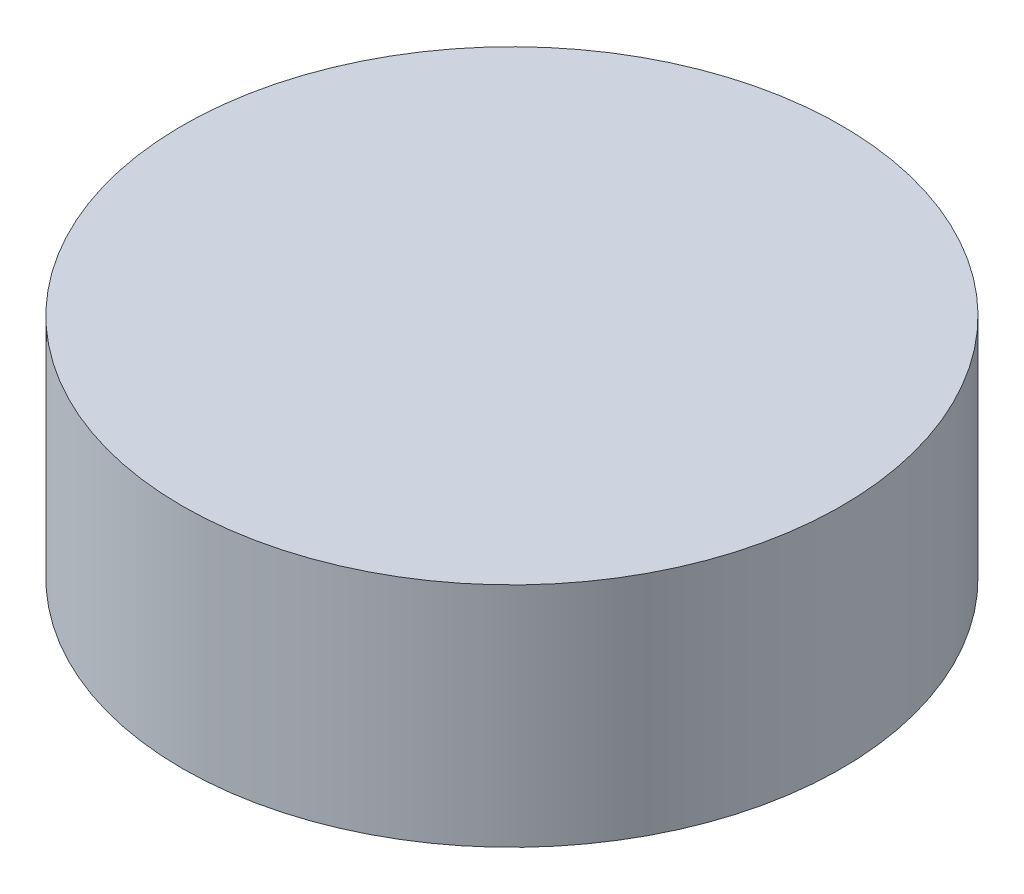
ISO-10303-21;
HEADER;
FILE_DESCRIPTION(('STEP AP214'),'2;1');
FILE_NAME('part.step','',(''),(''),'','','');
FILE_SCHEMA(('AUTOMOTIVE_DESIGN { 1 0 10303 214 1 1 1 1 }'));
ENDSEC;
DATA;
#1=APPLICATION_CONTEXT('core data for automotive mechanical design processes');
#2=APPLICATION_PROTOCOL_DEFINITION('international standard','automotive_design',2000,#1);
#3=PRODUCT_CONTEXT('',#1,'mechanical');
#4=PRODUCT('Part','Part','',(#3));
#5=PRODUCT_RELATED_PRODUCT_CATEGORY('part','',(#4));
#6=PRODUCT_DEFINITION_FORMATION('','',#4);
#7=PRODUCT_DEFINITION_CONTEXT('part definition',#1,'design');
#8=PRODUCT_DEFINITION('design','',#6,#7);
#9=PRODUCT_DEFINITION_SHAPE('','',#8);
#10=(LENGTH_UNIT() NAMED_UNIT(*) SI_UNIT(.MILLI.,.METRE.));
#11=(NAMED_UNIT(*) PLANE_ANGLE_UNIT() SI_UNIT($,.RADIAN.));
#12=(NAMED_UNIT(*) SI_UNIT($,.STERADIAN.) SOLID_ANGLE_UNIT());
#13=UNCERTAINTY_MEASURE_WITH_UNIT(LENGTH_MEASURE(1.E-05),#10,'distance_accuracy_value','');
#14=(GEOMETRIC_REPRESENTATION_CONTEXT(3) GLOBAL_UNCERTAINTY_ASSIGNED_CONTEXT((#13)) GLOBAL_UNIT_ASSIGNED_CONTEXT((#10,
#11,#12)) REPRESENTATION_CONTEXT('',''));
#15=CARTESIAN_POINT('',(0.,0.,0.));
#16=DIRECTION('',(0.,0.,1.));
#17=DIRECTION('',(1.,0.,0.));
#18=AXIS2_PLACEMENT_3D('',#15,#16,#17);
#19=CARTESIAN_POINT('',(0.,25.4,0.));
#20=DIRECTION('',(0.,-1.,0.));
#21=DIRECTION('',(0.,0.,-1.));
#22=AXIS2_PLACEMENT_3D('',#19,#20,#21);
#23=CYLINDRICAL_SURFACE('',#22,36.83);
#24=CARTESIAN_POINT('',(0.,25.4,0.));
#25=DIRECTION('',(0.,1.,0.));
#26=DIRECTION('',(0.,0.,1.));
#27=AXIS2_PLACEMENT_3D('',#24,#25,#26);
#28=CIRCLE('',#27,36.83);
#29=CARTESIAN_POINT('',(0.,25.4,36.83));
#30=VERTEX_POINT('',#29);
#31=EDGE_CURVE('E10',#30,#30,#28,.T.);
#32=ORIENTED_EDGE('',*,*,#31,.F.);
#33=EDGE_LOOP('',(#32));
#34=FACE_BOUND('',#33,.T.);
#35=CARTESIAN_POINT('',(0.,0.,0.));
#36=DIRECTION('',(0.,1.,0.));
#37=DIRECTION('',(0.,0.,1.));
#38=AXIS2_PLACEMENT_3D('',#35,#36,#37);
#39=CIRCLE('',#38,36.83);
#40=CARTESIAN_POINT('',(0.,0.,36.83));
#41=VERTEX_POINT('',#40);
#42=EDGE_CURVE('E38',#41,#41,#39,.T.);
#43=ORIENTED_EDGE('',*,*,#42,.T.);
#44=EDGE_LOOP('',(#43));
#45=FACE_BOUND('',#44,.T.);
#46=ADVANCED_FACE('F35',(#34,#45),#23,.T.);
#47=CARTESIAN_POINT('',(0.,25.4,0.));
#48=DIRECTION('',(0.,1.,0.));
#49=DIRECTION('',(0.,0.,1.));
#50=AXIS2_PLACEMENT_3D('',#47,#48,#49);
#51=PLANE('',#50);
#52=ORIENTED_EDGE('',*,*,#31,.T.);
#53=EDGE_LOOP('',(#52));
#54=FACE_BOUND('',#53,.T.);
#55=ADVANCED_FACE('F50',(#54),#51,.T.);
#56=CARTESIAN_POINT('',(0.,0.,0.));
#57=DIRECTION('',(0.,1.,0.));
#58=DIRECTION('',(0.,0.,1.));
#59=AXIS2_PLACEMENT_3D('',#56,#57,#58);
#60=PLANE('',#59);
#61=ORIENTED_EDGE('',*,*,#42,.F.);
#62=EDGE_LOOP('',(#61));
#63=FACE_BOUND('',#62,.T.);
#64=ADVANCED_FACE('F48',(#63),#60,.F.);
#65=CLOSED_SHELL('',(#46,#55,#64));
#66=MANIFOLD_SOLID_BREP('B2',#65);
#67=ADVANCED_BREP_SHAPE_REPRESENTATION('',(#18,#66),#14);
#68=SHAPE_DEFINITION_REPRESENTATION(#9,#67);
ENDSEC;
END-ISO-10303-21;
